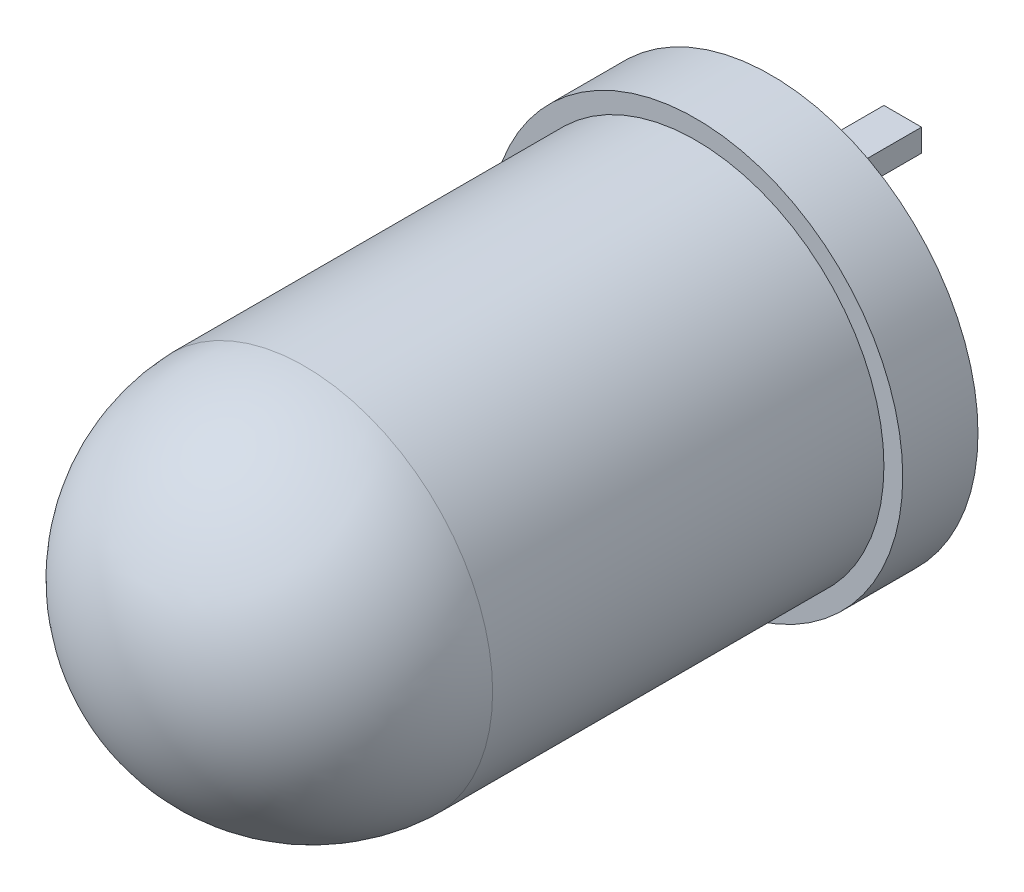
ISO-10303-21;
HEADER;
FILE_DESCRIPTION(('STEP AP214'),'2;1');
FILE_NAME('part.step','',(''),(''),'','','');
FILE_SCHEMA(('AUTOMOTIVE_DESIGN { 1 0 10303 214 1 1 1 1 }'));
ENDSEC;
DATA;
#1=APPLICATION_CONTEXT('core data for automotive mechanical design processes');
#2=APPLICATION_PROTOCOL_DEFINITION('international standard','automotive_design',2000,#1);
#3=PRODUCT_CONTEXT('',#1,'mechanical');
#4=PRODUCT('Part','Part','',(#3));
#5=PRODUCT_RELATED_PRODUCT_CATEGORY('part','',(#4));
#6=PRODUCT_DEFINITION_FORMATION('','',#4);
#7=PRODUCT_DEFINITION_CONTEXT('part definition',#1,'design');
#8=PRODUCT_DEFINITION('design','',#6,#7);
#9=PRODUCT_DEFINITION_SHAPE('','',#8);
#10=(LENGTH_UNIT() NAMED_UNIT(*) SI_UNIT(.MILLI.,.METRE.));
#11=(NAMED_UNIT(*) PLANE_ANGLE_UNIT() SI_UNIT($,.RADIAN.));
#12=(NAMED_UNIT(*) SI_UNIT($,.STERADIAN.) SOLID_ANGLE_UNIT());
#13=UNCERTAINTY_MEASURE_WITH_UNIT(LENGTH_MEASURE(1.E-05),#10,'distance_accuracy_value','');
#14=(GEOMETRIC_REPRESENTATION_CONTEXT(3) GLOBAL_UNCERTAINTY_ASSIGNED_CONTEXT((#13)) GLOBAL_UNIT_ASSIGNED_CONTEXT((#10,
#11,#12)) REPRESENTATION_CONTEXT('',''));
#15=CARTESIAN_POINT('',(0.,0.,0.));
#16=DIRECTION('',(0.,0.,1.));
#17=DIRECTION('',(1.,0.,0.));
#18=AXIS2_PLACEMENT_3D('',#15,#16,#17);
#19=CARTESIAN_POINT('',(0.,0.,2.6));
#20=DIRECTION('',(0.,0.,-1.));
#21=DIRECTION('',(-1.,0.,0.));
#22=AXIS2_PLACEMENT_3D('',#19,#20,#21);
#23=CYLINDRICAL_SURFACE('',#22,2.5);
#24=CARTESIAN_POINT('',(0.,0.,2.6));
#25=DIRECTION('',(0.,0.,1.));
#26=DIRECTION('',(1.,0.,0.));
#27=AXIS2_PLACEMENT_3D('',#24,#25,#26);
#28=CIRCLE('',#27,2.5);
#29=CARTESIAN_POINT('',(2.5,0.,2.6));
#30=VERTEX_POINT('',#29);
#31=EDGE_CURVE('E11',#30,#30,#28,.T.);
#32=ORIENTED_EDGE('',*,*,#31,.F.);
#33=EDGE_LOOP('',(#32));
#34=FACE_BOUND('',#33,.T.);
#35=CARTESIAN_POINT('',(0.,0.,-2.6));
#36=DIRECTION('',(0.,0.,1.));
#37=DIRECTION('',(1.,0.,0.));
#38=AXIS2_PLACEMENT_3D('',#35,#36,#37);
#39=CIRCLE('',#38,2.5);
#40=CARTESIAN_POINT('',(2.5,0.,-2.6));
#41=VERTEX_POINT('',#40);
#42=EDGE_CURVE('E49',#41,#41,#39,.T.);
#43=ORIENTED_EDGE('',*,*,#42,.T.);
#44=EDGE_LOOP('',(#43));
#45=FACE_BOUND('',#44,.T.);
#46=ADVANCED_FACE('F41',(#34,#45),#23,.T.);
#47=CARTESIAN_POINT('',(0.,0.,2.49791666666667));
#48=DIRECTION('',(0.,0.,1.));
#49=DIRECTION('',(1.,0.,0.));
#50=AXIS2_PLACEMENT_3D('',#47,#48,#49);
#51=SPHERICAL_SURFACE('',#50,2.50208333333333);
#52=ORIENTED_EDGE('',*,*,#31,.T.);
#53=EDGE_LOOP('',(#52));
#54=FACE_BOUND('',#53,.T.);
#55=ADVANCED_FACE('F43',(#54),#51,.T.);
#56=CARTESIAN_POINT('',(0.,0.,-3.6));
#57=DIRECTION('',(0.,0.,1.));
#58=DIRECTION('',(1.,0.,0.));
#59=AXIS2_PLACEMENT_3D('',#56,#57,#58);
#60=CYLINDRICAL_SURFACE('',#59,2.75);
#61=CARTESIAN_POINT('',(0.,0.,-3.6));
#62=DIRECTION('',(0.,0.,1.));
#63=DIRECTION('',(1.,0.,0.));
#64=AXIS2_PLACEMENT_3D('',#61,#62,#63);
#65=CIRCLE('',#64,2.75);
#66=CARTESIAN_POINT('',(2.75,0.,-3.6));
#67=VERTEX_POINT('',#66);
#68=EDGE_CURVE('E133',#67,#67,#65,.T.);
#69=ORIENTED_EDGE('',*,*,#68,.T.);
#70=EDGE_LOOP('',(#69));
#71=FACE_BOUND('',#70,.T.);
#72=CARTESIAN_POINT('',(0.,0.,-2.6));
#73=DIRECTION('',(0.,0.,1.));
#74=DIRECTION('',(1.,0.,0.));
#75=AXIS2_PLACEMENT_3D('',#72,#73,#74);
#76=CIRCLE('',#75,2.75);
#77=CARTESIAN_POINT('',(2.75,0.,-2.6));
#78=VERTEX_POINT('',#77);
#79=EDGE_CURVE('E126',#78,#78,#76,.T.);
#80=ORIENTED_EDGE('',*,*,#79,.F.);
#81=EDGE_LOOP('',(#80));
#82=FACE_BOUND('',#81,.T.);
#83=ADVANCED_FACE('F149',(#71,#82),#60,.T.);
#84=CARTESIAN_POINT('',(0.,0.,-3.6));
#85=DIRECTION('',(0.,0.,1.));
#86=DIRECTION('',(1.,0.,0.));
#87=AXIS2_PLACEMENT_3D('',#84,#85,#86);
#88=PLANE('',#87);
#89=DIRECTION('',(0.,-1.,0.));
#90=VECTOR('',#89,1.);
#91=CARTESIAN_POINT('',(-1.5,0.,-3.6));
#92=LINE('',#91,#90);
#93=CARTESIAN_POINT('',(-1.5,0.15,-3.6));
#94=VERTEX_POINT('',#93);
#95=CARTESIAN_POINT('',(-1.5,-0.15,-3.6));
#96=VERTEX_POINT('',#95);
#97=EDGE_CURVE('E285',#94,#96,#92,.T.);
#98=ORIENTED_EDGE('',*,*,#97,.T.);
#99=DIRECTION('',(1.,0.,0.));
#100=VECTOR('',#99,1.);
#101=CARTESIAN_POINT('',(0.,-0.15,-3.6));
#102=LINE('',#101,#100);
#103=CARTESIAN_POINT('',(-1.,-0.15,-3.6));
#104=VERTEX_POINT('',#103);
#105=EDGE_CURVE('E274',#96,#104,#102,.T.);
#106=ORIENTED_EDGE('',*,*,#105,.T.);
#107=DIRECTION('',(0.,1.,0.));
#108=VECTOR('',#107,1.);
#109=CARTESIAN_POINT('',(-1.,0.,-3.6));
#110=LINE('',#109,#108);
#111=CARTESIAN_POINT('',(-1.,0.15,-3.6));
#112=VERTEX_POINT('',#111);
#113=EDGE_CURVE('E277',#104,#112,#110,.T.);
#114=ORIENTED_EDGE('',*,*,#113,.T.);
#115=DIRECTION('',(-1.,0.,0.));
#116=VECTOR('',#115,1.);
#117=CARTESIAN_POINT('',(0.,0.15,-3.6));
#118=LINE('',#117,#116);
#119=EDGE_CURVE('E64',#112,#94,#118,.T.);
#120=ORIENTED_EDGE('',*,*,#119,.T.);
#121=EDGE_LOOP('',(#98,#106,#114,#120));
#122=FACE_BOUND('',#121,.T.);
#123=DIRECTION('',(0.,-1.,0.));
#124=VECTOR('',#123,1.);
#125=CARTESIAN_POINT('',(1.,0.,-3.6));
#126=LINE('',#125,#124);
#127=CARTESIAN_POINT('',(1.,0.15,-3.6));
#128=VERTEX_POINT('',#127);
#129=CARTESIAN_POINT('',(1.,-0.15,-3.6));
#130=VERTEX_POINT('',#129);
#131=EDGE_CURVE('E122',#128,#130,#126,.T.);
#132=ORIENTED_EDGE('',*,*,#131,.T.);
#133=DIRECTION('',(1.,0.,0.));
#134=VECTOR('',#133,1.);
#135=CARTESIAN_POINT('',(0.,-0.15,-3.6));
#136=LINE('',#135,#134);
#137=CARTESIAN_POINT('',(1.5,-0.15,-3.6));
#138=VERTEX_POINT('',#137);
#139=EDGE_CURVE('E302',#130,#138,#136,.T.);
#140=ORIENTED_EDGE('',*,*,#139,.T.);
#141=DIRECTION('',(0.,1.,0.));
#142=VECTOR('',#141,1.);
#143=CARTESIAN_POINT('',(1.5,0.,-3.6));
#144=LINE('',#143,#142);
#145=CARTESIAN_POINT('',(1.5,0.15,-3.6));
#146=VERTEX_POINT('',#145);
#147=EDGE_CURVE('E310',#138,#146,#144,.T.);
#148=ORIENTED_EDGE('',*,*,#147,.T.);
#149=DIRECTION('',(-1.,0.,0.));
#150=VECTOR('',#149,1.);
#151=CARTESIAN_POINT('',(0.,0.15,-3.6));
#152=LINE('',#151,#150);
#153=EDGE_CURVE('E313',#146,#128,#152,.T.);
#154=ORIENTED_EDGE('',*,*,#153,.T.);
#155=EDGE_LOOP('',(#132,#140,#148,#154));
#156=FACE_BOUND('',#155,.T.);
#157=ORIENTED_EDGE('',*,*,#68,.F.);
#158=EDGE_LOOP('',(#157));
#159=FACE_BOUND('',#158,.T.);
#160=ADVANCED_FACE('F145',(#122,#156,#159),#88,.F.);
#161=CARTESIAN_POINT('',(0.,0.,-2.6));
#162=DIRECTION('',(0.,0.,1.));
#163=DIRECTION('',(1.,0.,0.));
#164=AXIS2_PLACEMENT_3D('',#161,#162,#163);
#165=PLANE('',#164);
#166=ORIENTED_EDGE('',*,*,#42,.F.);
#167=EDGE_LOOP('',(#166));
#168=FACE_BOUND('',#167,.T.);
#169=ORIENTED_EDGE('',*,*,#79,.T.);
#170=EDGE_LOOP('',(#169));
#171=FACE_BOUND('',#170,.T.);
#172=ADVANCED_FACE('F141',(#168,#171),#165,.T.);
#173=CARTESIAN_POINT('',(0.,-0.15,-6.6));
#174=DIRECTION('',(0.,-1.,0.));
#175=DIRECTION('',(1.,0.,0.));
#176=AXIS2_PLACEMENT_3D('',#173,#174,#175);
#177=PLANE('',#176);
#178=DIRECTION('',(1.,0.,0.));
#179=VECTOR('',#178,1.);
#180=CARTESIAN_POINT('',(0.,-0.15,-4.6));
#181=LINE('',#180,#179);
#182=CARTESIAN_POINT('',(1.,-0.15,-4.6));
#183=VERTEX_POINT('',#182);
#184=CARTESIAN_POINT('',(1.5,-0.15,-4.6));
#185=VERTEX_POINT('',#184);
#186=EDGE_CURVE('E107',#183,#185,#181,.T.);
#187=ORIENTED_EDGE('',*,*,#186,.T.);
#188=DIRECTION('',(0.,0.,1.));
#189=VECTOR('',#188,1.);
#190=CARTESIAN_POINT('',(1.5,-0.15,-6.6));
#191=LINE('',#190,#189);
#192=EDGE_CURVE('E128',#185,#138,#191,.T.);
#193=ORIENTED_EDGE('',*,*,#192,.T.);
#194=ORIENTED_EDGE('',*,*,#139,.F.);
#195=DIRECTION('',(0.,0.,1.));
#196=VECTOR('',#195,1.);
#197=CARTESIAN_POINT('',(1.,-0.15,-6.6));
#198=LINE('',#197,#196);
#199=EDGE_CURVE('E124',#183,#130,#198,.T.);
#200=ORIENTED_EDGE('',*,*,#199,.F.);
#201=EDGE_LOOP('',(#187,#193,#194,#200));
#202=FACE_BOUND('',#201,.T.);
#203=ADVANCED_FACE('F144',(#202),#177,.T.);
#204=CARTESIAN_POINT('',(1.,0.,-6.6));
#205=DIRECTION('',(-1.,0.,0.));
#206=DIRECTION('',(0.,0.,1.));
#207=AXIS2_PLACEMENT_3D('',#204,#205,#206);
#208=PLANE('',#207);
#209=DIRECTION('',(0.,-1.,0.));
#210=VECTOR('',#209,1.);
#211=CARTESIAN_POINT('',(1.,0.,-4.6));
#212=LINE('',#211,#210);
#213=CARTESIAN_POINT('',(1.,0.15,-4.6));
#214=VERTEX_POINT('',#213);
#215=EDGE_CURVE('E104',#214,#183,#212,.T.);
#216=ORIENTED_EDGE('',*,*,#215,.T.);
#217=ORIENTED_EDGE('',*,*,#199,.T.);
#218=ORIENTED_EDGE('',*,*,#131,.F.);
#219=DIRECTION('',(0.,0.,1.));
#220=VECTOR('',#219,1.);
#221=CARTESIAN_POINT('',(1.,0.15,-6.6));
#222=LINE('',#221,#220);
#223=EDGE_CURVE('E116',#214,#128,#222,.T.);
#224=ORIENTED_EDGE('',*,*,#223,.F.);
#225=EDGE_LOOP('',(#216,#217,#218,#224));
#226=FACE_BOUND('',#225,.T.);
#227=ADVANCED_FACE('F120',(#226),#208,.T.);
#228=CARTESIAN_POINT('',(0.,0.15,-6.6));
#229=DIRECTION('',(0.,1.,0.));
#230=DIRECTION('',(-1.,0.,0.));
#231=AXIS2_PLACEMENT_3D('',#228,#229,#230);
#232=PLANE('',#231);
#233=DIRECTION('',(-1.,0.,0.));
#234=VECTOR('',#233,1.);
#235=CARTESIAN_POINT('',(0.,0.15,-4.6));
#236=LINE('',#235,#234);
#237=CARTESIAN_POINT('',(1.5,0.15,-4.6));
#238=VERTEX_POINT('',#237);
#239=EDGE_CURVE('E56',#238,#214,#236,.T.);
#240=ORIENTED_EDGE('',*,*,#239,.T.);
#241=ORIENTED_EDGE('',*,*,#223,.T.);
#242=ORIENTED_EDGE('',*,*,#153,.F.);
#243=DIRECTION('',(0.,0.,1.));
#244=VECTOR('',#243,1.);
#245=CARTESIAN_POINT('',(1.5,0.15,-6.6));
#246=LINE('',#245,#244);
#247=EDGE_CURVE('E118',#238,#146,#246,.T.);
#248=ORIENTED_EDGE('',*,*,#247,.F.);
#249=EDGE_LOOP('',(#240,#241,#242,#248));
#250=FACE_BOUND('',#249,.T.);
#251=ADVANCED_FACE('F114',(#250),#232,.T.);
#252=CARTESIAN_POINT('',(1.5,0.,-6.6));
#253=DIRECTION('',(1.,0.,0.));
#254=DIRECTION('',(0.,0.,-1.));
#255=AXIS2_PLACEMENT_3D('',#252,#253,#254);
#256=PLANE('',#255);
#257=DIRECTION('',(0.,1.,0.));
#258=VECTOR('',#257,1.);
#259=CARTESIAN_POINT('',(1.5,0.,-4.6));
#260=LINE('',#259,#258);
#261=EDGE_CURVE('E272',#185,#238,#260,.T.);
#262=ORIENTED_EDGE('',*,*,#261,.T.);
#263=ORIENTED_EDGE('',*,*,#247,.T.);
#264=ORIENTED_EDGE('',*,*,#147,.F.);
#265=ORIENTED_EDGE('',*,*,#192,.F.);
#266=EDGE_LOOP('',(#262,#263,#264,#265));
#267=FACE_BOUND('',#266,.T.);
#268=ADVANCED_FACE('F187',(#267),#256,.T.);
#269=CARTESIAN_POINT('',(0.,-0.15,-6.6));
#270=DIRECTION('',(0.,-1.,0.));
#271=DIRECTION('',(1.,0.,0.));
#272=AXIS2_PLACEMENT_3D('',#269,#270,#271);
#273=PLANE('',#272);
#274=ORIENTED_EDGE('',*,*,#105,.F.);
#275=DIRECTION('',(0.,0.,1.));
#276=VECTOR('',#275,1.);
#277=CARTESIAN_POINT('',(-1.5,-0.15,-6.6));
#278=LINE('',#277,#276);
#279=CARTESIAN_POINT('',(-1.5,-0.15,-6.6));
#280=VERTEX_POINT('',#279);
#281=EDGE_CURVE('E300',#280,#96,#278,.T.);
#282=ORIENTED_EDGE('',*,*,#281,.F.);
#283=DIRECTION('',(1.,0.,0.));
#284=VECTOR('',#283,1.);
#285=CARTESIAN_POINT('',(0.,-0.15,-6.6));
#286=LINE('',#285,#284);
#287=CARTESIAN_POINT('',(-1.,-0.15,-6.6));
#288=VERTEX_POINT('',#287);
#289=EDGE_CURVE('E281',#280,#288,#286,.T.);
#290=ORIENTED_EDGE('',*,*,#289,.T.);
#291=DIRECTION('',(0.,0.,1.));
#292=VECTOR('',#291,1.);
#293=CARTESIAN_POINT('',(-1.,-0.15,-6.6));
#294=LINE('',#293,#292);
#295=EDGE_CURVE('E293',#288,#104,#294,.T.);
#296=ORIENTED_EDGE('',*,*,#295,.T.);
#297=EDGE_LOOP('',(#274,#282,#290,#296));
#298=FACE_BOUND('',#297,.T.);
#299=ADVANCED_FACE('F181',(#298),#273,.T.);
#300=CARTESIAN_POINT('',(-1.5,0.,-6.6));
#301=DIRECTION('',(-1.,0.,0.));
#302=DIRECTION('',(0.,0.,1.));
#303=AXIS2_PLACEMENT_3D('',#300,#301,#302);
#304=PLANE('',#303);
#305=ORIENTED_EDGE('',*,*,#97,.F.);
#306=DIRECTION('',(0.,0.,1.));
#307=VECTOR('',#306,1.);
#308=CARTESIAN_POINT('',(-1.5,0.15,-6.6));
#309=LINE('',#308,#307);
#310=CARTESIAN_POINT('',(-1.5,0.15,-6.6));
#311=VERTEX_POINT('',#310);
#312=EDGE_CURVE('E303',#311,#94,#309,.T.);
#313=ORIENTED_EDGE('',*,*,#312,.F.);
#314=DIRECTION('',(0.,-1.,0.));
#315=VECTOR('',#314,1.);
#316=CARTESIAN_POINT('',(-1.5,0.,-6.6));
#317=LINE('',#316,#315);
#318=EDGE_CURVE('E291',#311,#280,#317,.T.);
#319=ORIENTED_EDGE('',*,*,#318,.T.);
#320=ORIENTED_EDGE('',*,*,#281,.T.);
#321=EDGE_LOOP('',(#305,#313,#319,#320));
#322=FACE_BOUND('',#321,.T.);
#323=ADVANCED_FACE('F186',(#322),#304,.T.);
#324=CARTESIAN_POINT('',(0.,0.15,-6.6));
#325=DIRECTION('',(0.,1.,0.));
#326=DIRECTION('',(-1.,0.,0.));
#327=AXIS2_PLACEMENT_3D('',#324,#325,#326);
#328=PLANE('',#327);
#329=ORIENTED_EDGE('',*,*,#119,.F.);
#330=DIRECTION('',(0.,0.,1.));
#331=VECTOR('',#330,1.);
#332=CARTESIAN_POINT('',(-1.,0.15,-6.6));
#333=LINE('',#332,#331);
#334=CARTESIAN_POINT('',(-1.,0.15,-6.6));
#335=VERTEX_POINT('',#334);
#336=EDGE_CURVE('E305',#335,#112,#333,.T.);
#337=ORIENTED_EDGE('',*,*,#336,.F.);
#338=DIRECTION('',(-1.,0.,0.));
#339=VECTOR('',#338,1.);
#340=CARTESIAN_POINT('',(0.,0.15,-6.6));
#341=LINE('',#340,#339);
#342=EDGE_CURVE('E288',#335,#311,#341,.T.);
#343=ORIENTED_EDGE('',*,*,#342,.T.);
#344=ORIENTED_EDGE('',*,*,#312,.T.);
#345=EDGE_LOOP('',(#329,#337,#343,#344));
#346=FACE_BOUND('',#345,.T.);
#347=ADVANCED_FACE('F199',(#346),#328,.T.);
#348=CARTESIAN_POINT('',(-1.,0.,-6.6));
#349=DIRECTION('',(1.,0.,0.));
#350=DIRECTION('',(0.,0.,-1.));
#351=AXIS2_PLACEMENT_3D('',#348,#349,#350);
#352=PLANE('',#351);
#353=ORIENTED_EDGE('',*,*,#113,.F.);
#354=ORIENTED_EDGE('',*,*,#295,.F.);
#355=DIRECTION('',(0.,1.,0.));
#356=VECTOR('',#355,1.);
#357=CARTESIAN_POINT('',(-1.,0.,-6.6));
#358=LINE('',#357,#356);
#359=EDGE_CURVE('E284',#288,#335,#358,.T.);
#360=ORIENTED_EDGE('',*,*,#359,.T.);
#361=ORIENTED_EDGE('',*,*,#336,.T.);
#362=EDGE_LOOP('',(#353,#354,#360,#361));
#363=FACE_BOUND('',#362,.T.);
#364=ADVANCED_FACE('F209',(#363),#352,.T.);
#365=CARTESIAN_POINT('',(0.,0.,-6.6));
#366=DIRECTION('',(0.,0.,1.));
#367=DIRECTION('',(1.,0.,0.));
#368=AXIS2_PLACEMENT_3D('',#365,#366,#367);
#369=PLANE('',#368);
#370=ORIENTED_EDGE('',*,*,#289,.F.);
#371=ORIENTED_EDGE('',*,*,#318,.F.);
#372=ORIENTED_EDGE('',*,*,#342,.F.);
#373=ORIENTED_EDGE('',*,*,#359,.F.);
#374=EDGE_LOOP('',(#370,#371,#372,#373));
#375=FACE_BOUND('',#374,.T.);
#376=ADVANCED_FACE('F218',(#375),#369,.F.);
#377=CARTESIAN_POINT('',(0.,0.,-4.6));
#378=DIRECTION('',(0.,0.,1.));
#379=DIRECTION('',(1.,0.,0.));
#380=AXIS2_PLACEMENT_3D('',#377,#378,#379);
#381=PLANE('',#380);
#382=ORIENTED_EDGE('',*,*,#239,.F.);
#383=ORIENTED_EDGE('',*,*,#261,.F.);
#384=ORIENTED_EDGE('',*,*,#186,.F.);
#385=ORIENTED_EDGE('',*,*,#215,.F.);
#386=EDGE_LOOP('',(#382,#383,#384,#385));
#387=FACE_BOUND('',#386,.T.);
#388=ADVANCED_FACE('F105',(#387),#381,.F.);
#389=CLOSED_SHELL('',(#46,#55,#83,#160,#172,#203,#227,#251,#268,#299,#323,#347,#364,#376,#388));
#390=MANIFOLD_SOLID_BREP('B2',#389);
#391=ADVANCED_BREP_SHAPE_REPRESENTATION('',(#18,#390),#14);
#392=SHAPE_DEFINITION_REPRESENTATION(#9,#391);
ENDSEC;
END-ISO-10303-21;
